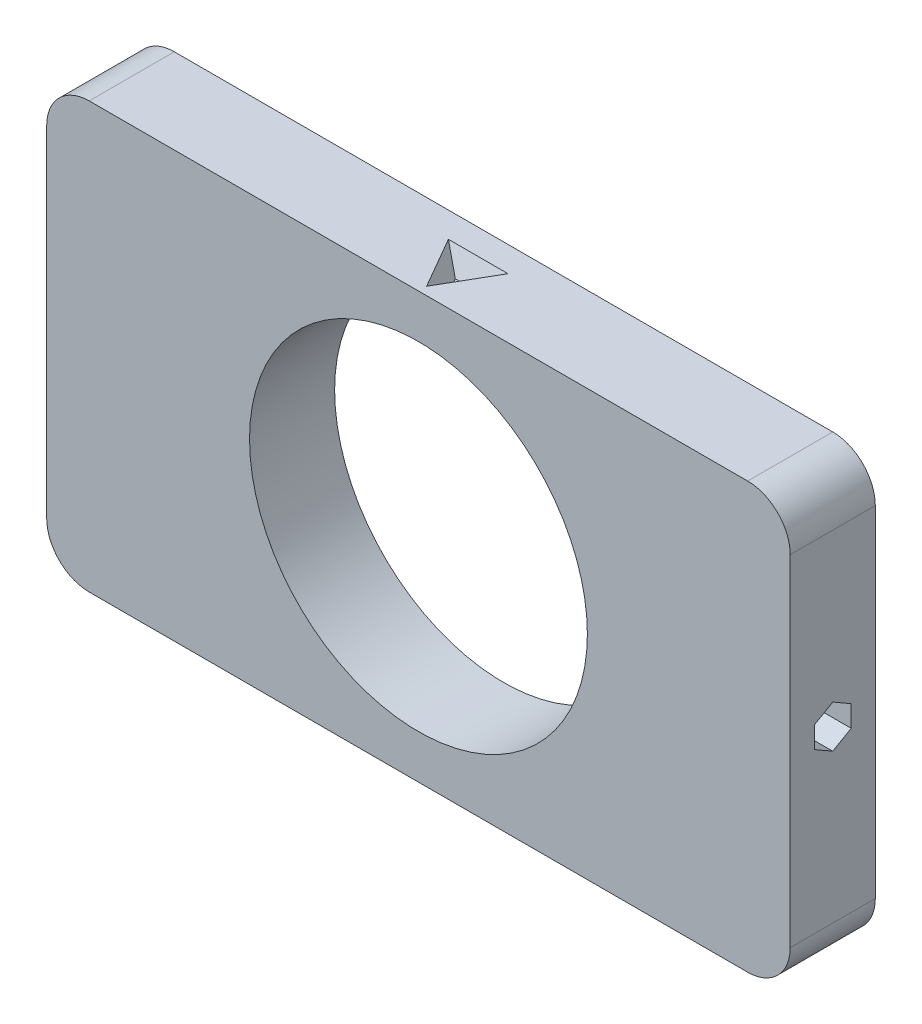
ISO-10303-21;
HEADER;
FILE_DESCRIPTION(('STEP AP214'),'2;1');
FILE_NAME('part.step','',(''),(''),'','','');
FILE_SCHEMA(('AUTOMOTIVE_DESIGN { 1 0 10303 214 1 1 1 1 }'));
ENDSEC;
DATA;
#1=APPLICATION_CONTEXT('core data for automotive mechanical design processes');
#2=APPLICATION_PROTOCOL_DEFINITION('international standard','automotive_design',2000,#1);
#3=PRODUCT_CONTEXT('',#1,'mechanical');
#4=PRODUCT('Part','Part','',(#3));
#5=PRODUCT_RELATED_PRODUCT_CATEGORY('part','',(#4));
#6=PRODUCT_DEFINITION_FORMATION('','',#4);
#7=PRODUCT_DEFINITION_CONTEXT('part definition',#1,'design');
#8=PRODUCT_DEFINITION('design','',#6,#7);
#9=PRODUCT_DEFINITION_SHAPE('','',#8);
#10=(LENGTH_UNIT() NAMED_UNIT(*) SI_UNIT(.MILLI.,.METRE.));
#11=(NAMED_UNIT(*) PLANE_ANGLE_UNIT() SI_UNIT($,.RADIAN.));
#12=(NAMED_UNIT(*) SI_UNIT($,.STERADIAN.) SOLID_ANGLE_UNIT());
#13=UNCERTAINTY_MEASURE_WITH_UNIT(LENGTH_MEASURE(1.E-05),#10,'distance_accuracy_value','');
#14=(GEOMETRIC_REPRESENTATION_CONTEXT(3) GLOBAL_UNCERTAINTY_ASSIGNED_CONTEXT((#13)) GLOBAL_UNIT_ASSIGNED_CONTEXT((#10,
#11,#12)) REPRESENTATION_CONTEXT('',''));
#15=CARTESIAN_POINT('',(0.,0.,0.));
#16=DIRECTION('',(0.,0.,1.));
#17=DIRECTION('',(1.,0.,0.));
#18=AXIS2_PLACEMENT_3D('',#15,#16,#17);
#19=CARTESIAN_POINT('',(-77.3807179941776,-39.9898991315528,20.));
#20=DIRECTION('',(0.,0.,-1.));
#21=DIRECTION('',(-1.,0.,0.));
#22=AXIS2_PLACEMENT_3D('',#19,#20,#21);
#23=PLANE('',#22);
#24=CARTESIAN_POINT('',(-77.3807179941776,-39.9898991315528,20.));
#25=DIRECTION('',(0.,0.,1.));
#26=DIRECTION('',(-1.,0.,0.));
#27=AXIS2_PLACEMENT_3D('',#24,#25,#26);
#28=CIRCLE('',#27,9.99999999999999);
#29=CARTESIAN_POINT('',(-87.3807179941776,-39.9898991315527,20.));
#30=VERTEX_POINT('',#29);
#31=CARTESIAN_POINT('',(-77.3807179941775,-49.9898991315528,20.));
#32=VERTEX_POINT('',#31);
#33=EDGE_CURVE('E222',#30,#32,#28,.T.);
#34=ORIENTED_EDGE('',*,*,#33,.T.);
#35=DIRECTION('',(1.,0.,0.));
#36=VECTOR('',#35,1.);
#37=CARTESIAN_POINT('',(77.3807179941775,-49.9898991315528,20.));
#38=LINE('',#37,#36);
#39=CARTESIAN_POINT('',(77.3807179941775,-49.9898991315528,20.));
#40=VERTEX_POINT('',#39);
#41=EDGE_CURVE('E225',#32,#40,#38,.T.);
#42=ORIENTED_EDGE('',*,*,#41,.T.);
#43=CARTESIAN_POINT('',(77.3807179941776,-39.9898991315528,20.));
#44=DIRECTION('',(0.,0.,1.));
#45=DIRECTION('',(1.,0.,0.));
#46=AXIS2_PLACEMENT_3D('',#43,#44,#45);
#47=CIRCLE('',#46,9.99999999999999);
#48=CARTESIAN_POINT('',(87.3807179941776,-39.9898991315528,20.));
#49=VERTEX_POINT('',#48);
#50=EDGE_CURVE('E228',#40,#49,#47,.T.);
#51=ORIENTED_EDGE('',*,*,#50,.T.);
#52=DIRECTION('',(0.,1.,0.));
#53=VECTOR('',#52,1.);
#54=CARTESIAN_POINT('',(87.3807179941776,-39.9898991315527,20.));
#55=LINE('',#54,#53);
#56=CARTESIAN_POINT('',(87.3807179941776,39.9898991315527,20.));
#57=VERTEX_POINT('',#56);
#58=EDGE_CURVE('E230',#49,#57,#55,.T.);
#59=ORIENTED_EDGE('',*,*,#58,.T.);
#60=CARTESIAN_POINT('',(77.3807179941776,39.9898991315528,20.));
#61=DIRECTION('',(0.,0.,1.));
#62=DIRECTION('',(1.,0.,0.));
#63=AXIS2_PLACEMENT_3D('',#60,#61,#62);
#64=CIRCLE('',#63,9.99999999999999);
#65=CARTESIAN_POINT('',(77.3807179941775,49.9898991315528,20.));
#66=VERTEX_POINT('',#65);
#67=EDGE_CURVE('E232',#57,#66,#64,.T.);
#68=ORIENTED_EDGE('',*,*,#67,.T.);
#69=DIRECTION('',(-1.,0.,0.));
#70=VECTOR('',#69,1.);
#71=CARTESIAN_POINT('',(77.3807179941775,49.9898991315528,20.));
#72=LINE('',#71,#70);
#73=CARTESIAN_POINT('',(-77.3807179941775,49.9898991315528,20.));
#74=VERTEX_POINT('',#73);
#75=EDGE_CURVE('E234',#66,#74,#72,.T.);
#76=ORIENTED_EDGE('',*,*,#75,.T.);
#77=CARTESIAN_POINT('',(-77.3807179941776,39.9898991315528,20.));
#78=DIRECTION('',(0.,0.,1.));
#79=DIRECTION('',(1.,0.,0.));
#80=AXIS2_PLACEMENT_3D('',#77,#78,#79);
#81=CIRCLE('',#80,9.99999999999999);
#82=CARTESIAN_POINT('',(-87.3807179941776,39.9898991315527,20.));
#83=VERTEX_POINT('',#82);
#84=EDGE_CURVE('E236',#74,#83,#81,.T.);
#85=ORIENTED_EDGE('',*,*,#84,.T.);
#86=DIRECTION('',(0.,-1.,0.));
#87=VECTOR('',#86,1.);
#88=CARTESIAN_POINT('',(-87.3807179941776,-39.9898991315527,20.));
#89=LINE('',#88,#87);
#90=EDGE_CURVE('E238',#83,#30,#89,.T.);
#91=ORIENTED_EDGE('',*,*,#90,.T.);
#92=EDGE_LOOP('',(#34,#42,#51,#59,#68,#76,#85,#91));
#93=FACE_BOUND('',#92,.T.);
#94=CARTESIAN_POINT('',(0.,0.,20.));
#95=DIRECTION('',(0.,0.,1.));
#96=DIRECTION('',(1.,0.,0.));
#97=AXIS2_PLACEMENT_3D('',#94,#95,#96);
#98=CIRCLE('',#97,39.70520295939);
#99=CARTESIAN_POINT('',(39.7052029593901,0.,20.));
#100=VERTEX_POINT('',#99);
#101=EDGE_CURVE('E216',#100,#100,#98,.T.);
#102=ORIENTED_EDGE('',*,*,#101,.F.);
#103=EDGE_LOOP('',(#102));
#104=FACE_BOUND('',#103,.T.);
#105=ADVANCED_FACE('F33',(#93,#104),#23,.F.);
#106=CARTESIAN_POINT('',(-77.3807179941776,-39.9898991315528,0.));
#107=DIRECTION('',(0.,0.,-1.));
#108=DIRECTION('',(-1.,0.,0.));
#109=AXIS2_PLACEMENT_3D('',#106,#107,#108);
#110=PLANE('',#109);
#111=CARTESIAN_POINT('',(-77.3807179941776,-39.9898991315528,0.));
#112=DIRECTION('',(0.,0.,1.));
#113=DIRECTION('',(-1.,0.,0.));
#114=AXIS2_PLACEMENT_3D('',#111,#112,#113);
#115=CIRCLE('',#114,9.99999999999999);
#116=CARTESIAN_POINT('',(-87.3807179941776,-39.9898991315527,0.));
#117=VERTEX_POINT('',#116);
#118=CARTESIAN_POINT('',(-77.3807179941775,-49.9898991315528,0.));
#119=VERTEX_POINT('',#118);
#120=EDGE_CURVE('E219',#117,#119,#115,.T.);
#121=ORIENTED_EDGE('',*,*,#120,.F.);
#122=DIRECTION('',(0.,-1.,0.));
#123=VECTOR('',#122,1.);
#124=CARTESIAN_POINT('',(-87.3807179941776,-39.9898991315527,0.));
#125=LINE('',#124,#123);
#126=CARTESIAN_POINT('',(-87.3807179941776,39.9898991315527,0.));
#127=VERTEX_POINT('',#126);
#128=EDGE_CURVE('E226',#127,#117,#125,.T.);
#129=ORIENTED_EDGE('',*,*,#128,.F.);
#130=CARTESIAN_POINT('',(-77.3807179941776,39.9898991315528,0.));
#131=DIRECTION('',(0.,0.,1.));
#132=DIRECTION('',(1.,0.,0.));
#133=AXIS2_PLACEMENT_3D('',#130,#131,#132);
#134=CIRCLE('',#133,9.99999999999999);
#135=CARTESIAN_POINT('',(-77.3807179941775,49.9898991315528,0.));
#136=VERTEX_POINT('',#135);
#137=EDGE_CURVE('E253',#136,#127,#134,.T.);
#138=ORIENTED_EDGE('',*,*,#137,.F.);
#139=DIRECTION('',(-1.,0.,0.));
#140=VECTOR('',#139,1.);
#141=CARTESIAN_POINT('',(77.3807179941775,49.9898991315528,0.));
#142=LINE('',#141,#140);
#143=CARTESIAN_POINT('',(77.3807179941775,49.9898991315528,0.));
#144=VERTEX_POINT('',#143);
#145=EDGE_CURVE('E251',#144,#136,#142,.T.);
#146=ORIENTED_EDGE('',*,*,#145,.F.);
#147=CARTESIAN_POINT('',(77.3807179941776,39.9898991315528,0.));
#148=DIRECTION('',(0.,0.,1.));
#149=DIRECTION('',(1.,0.,0.));
#150=AXIS2_PLACEMENT_3D('',#147,#148,#149);
#151=CIRCLE('',#150,9.99999999999999);
#152=CARTESIAN_POINT('',(87.3807179941776,39.9898991315527,0.));
#153=VERTEX_POINT('',#152);
#154=EDGE_CURVE('E249',#153,#144,#151,.T.);
#155=ORIENTED_EDGE('',*,*,#154,.F.);
#156=DIRECTION('',(0.,1.,0.));
#157=VECTOR('',#156,1.);
#158=CARTESIAN_POINT('',(87.3807179941776,-39.9898991315527,0.));
#159=LINE('',#158,#157);
#160=CARTESIAN_POINT('',(87.3807179941776,-39.9898991315528,0.));
#161=VERTEX_POINT('',#160);
#162=EDGE_CURVE('E247',#161,#153,#159,.T.);
#163=ORIENTED_EDGE('',*,*,#162,.F.);
#164=CARTESIAN_POINT('',(77.3807179941776,-39.9898991315528,0.));
#165=DIRECTION('',(0.,0.,1.));
#166=DIRECTION('',(1.,0.,0.));
#167=AXIS2_PLACEMENT_3D('',#164,#165,#166);
#168=CIRCLE('',#167,9.99999999999999);
#169=CARTESIAN_POINT('',(77.3807179941775,-49.9898991315528,0.));
#170=VERTEX_POINT('',#169);
#171=EDGE_CURVE('E245',#170,#161,#168,.T.);
#172=ORIENTED_EDGE('',*,*,#171,.F.);
#173=DIRECTION('',(1.,0.,0.));
#174=VECTOR('',#173,1.);
#175=CARTESIAN_POINT('',(77.3807179941775,-49.9898991315528,0.));
#176=LINE('',#175,#174);
#177=EDGE_CURVE('E243',#119,#170,#176,.T.);
#178=ORIENTED_EDGE('',*,*,#177,.F.);
#179=EDGE_LOOP('',(#121,#129,#138,#146,#155,#163,#172,#178));
#180=FACE_BOUND('',#179,.T.);
#181=CARTESIAN_POINT('',(0.,0.,0.));
#182=DIRECTION('',(0.,0.,1.));
#183=DIRECTION('',(1.,0.,0.));
#184=AXIS2_PLACEMENT_3D('',#181,#182,#183);
#185=CIRCLE('',#184,39.70520295939);
#186=CARTESIAN_POINT('',(39.7052029593901,0.,0.));
#187=VERTEX_POINT('',#186);
#188=EDGE_CURVE('E202',#187,#187,#185,.T.);
#189=ORIENTED_EDGE('',*,*,#188,.T.);
#190=EDGE_LOOP('',(#189));
#191=FACE_BOUND('',#190,.T.);
#192=ADVANCED_FACE('F283',(#180,#191),#110,.T.);
#193=CARTESIAN_POINT('',(-77.3807179941776,-39.9898991315528,20.));
#194=DIRECTION('',(0.,0.,-1.));
#195=DIRECTION('',(-1.,0.,0.));
#196=AXIS2_PLACEMENT_3D('',#193,#194,#195);
#197=CYLINDRICAL_SURFACE('',#196,9.99999999999999);
#198=ORIENTED_EDGE('',*,*,#120,.T.);
#199=DIRECTION('',(0.,0.,-1.));
#200=VECTOR('',#199,1.);
#201=CARTESIAN_POINT('',(-77.3807179941775,-49.9898991315528,20.));
#202=LINE('',#201,#200);
#203=EDGE_CURVE('E11',#32,#119,#202,.T.);
#204=ORIENTED_EDGE('',*,*,#203,.F.);
#205=ORIENTED_EDGE('',*,*,#33,.F.);
#206=DIRECTION('',(0.,0.,-1.));
#207=VECTOR('',#206,1.);
#208=CARTESIAN_POINT('',(-87.3807179941776,-39.9898991315527,20.));
#209=LINE('',#208,#207);
#210=EDGE_CURVE('E240',#30,#117,#209,.T.);
#211=ORIENTED_EDGE('',*,*,#210,.T.);
#212=EDGE_LOOP('',(#198,#204,#205,#211));
#213=FACE_BOUND('',#212,.T.);
#214=ADVANCED_FACE('F35',(#213),#197,.T.);
#215=CARTESIAN_POINT('',(77.3807179941775,-49.9898991315528,20.));
#216=DIRECTION('',(0.,1.,0.));
#217=DIRECTION('',(0.,0.,1.));
#218=AXIS2_PLACEMENT_3D('',#215,#216,#217);
#219=PLANE('',#218);
#220=ORIENTED_EDGE('',*,*,#177,.T.);
#221=DIRECTION('',(0.,0.,-1.));
#222=VECTOR('',#221,1.);
#223=CARTESIAN_POINT('',(77.3807179941775,-49.9898991315528,20.));
#224=LINE('',#223,#222);
#225=EDGE_CURVE('E41',#40,#170,#224,.T.);
#226=ORIENTED_EDGE('',*,*,#225,.F.);
#227=ORIENTED_EDGE('',*,*,#41,.F.);
#228=ORIENTED_EDGE('',*,*,#203,.T.);
#229=EDGE_LOOP('',(#220,#226,#227,#228));
#230=FACE_BOUND('',#229,.T.);
#231=ADVANCED_FACE('F301',(#230),#219,.F.);
#232=CARTESIAN_POINT('',(77.3807179941776,-39.9898991315528,20.));
#233=DIRECTION('',(0.,0.,-1.));
#234=DIRECTION('',(-1.,0.,0.));
#235=AXIS2_PLACEMENT_3D('',#232,#233,#234);
#236=CYLINDRICAL_SURFACE('',#235,9.99999999999999);
#237=ORIENTED_EDGE('',*,*,#171,.T.);
#238=DIRECTION('',(0.,0.,-1.));
#239=VECTOR('',#238,1.);
#240=CARTESIAN_POINT('',(87.3807179941776,-39.9898991315528,20.));
#241=LINE('',#240,#239);
#242=EDGE_CURVE('E270',#49,#161,#241,.T.);
#243=ORIENTED_EDGE('',*,*,#242,.F.);
#244=ORIENTED_EDGE('',*,*,#50,.F.);
#245=ORIENTED_EDGE('',*,*,#225,.T.);
#246=EDGE_LOOP('',(#237,#243,#244,#245));
#247=FACE_BOUND('',#246,.T.);
#248=ADVANCED_FACE('F277',(#247),#236,.T.);
#249=CARTESIAN_POINT('',(87.3807179941776,-39.9898991315527,20.));
#250=DIRECTION('',(-1.,0.,0.));
#251=DIRECTION('',(0.,0.,1.));
#252=AXIS2_PLACEMENT_3D('',#249,#250,#251);
#253=PLANE('',#252);
#254=DIRECTION('',(0.,-0.499999999999999,0.866025403784439));
#255=VECTOR('',#254,1.);
#256=CARTESIAN_POINT('',(87.3807179941776,5.,10.));
#257=LINE('',#256,#255);
#258=CARTESIAN_POINT('',(87.3807179941776,5.,10.));
#259=VERTEX_POINT('',#258);
#260=CARTESIAN_POINT('',(87.3807179941776,2.5,14.3301270189222));
#261=VERTEX_POINT('',#260);
#262=EDGE_CURVE('E48',#259,#261,#257,.T.);
#263=ORIENTED_EDGE('',*,*,#262,.F.);
#264=DIRECTION('',(0.,0.500000000000001,0.866025403784438));
#265=VECTOR('',#264,1.);
#266=CARTESIAN_POINT('',(87.3807179941776,2.5,5.66987298107781));
#267=LINE('',#266,#265);
#268=CARTESIAN_POINT('',(87.3807179941776,2.5,5.66987298107781));
#269=VERTEX_POINT('',#268);
#270=EDGE_CURVE('E175',#269,#259,#267,.T.);
#271=ORIENTED_EDGE('',*,*,#270,.F.);
#272=DIRECTION('',(0.,1.,0.));
#273=VECTOR('',#272,1.);
#274=CARTESIAN_POINT('',(87.3807179941776,-2.5,5.66987298107781));
#275=LINE('',#274,#273);
#276=CARTESIAN_POINT('',(87.3807179941776,-2.5,5.66987298107781));
#277=VERTEX_POINT('',#276);
#278=EDGE_CURVE('E193',#277,#269,#275,.T.);
#279=ORIENTED_EDGE('',*,*,#278,.F.);
#280=DIRECTION('',(0.,0.5,-0.866025403784439));
#281=VECTOR('',#280,1.);
#282=CARTESIAN_POINT('',(87.3807179941776,-5.,10.));
#283=LINE('',#282,#281);
#284=CARTESIAN_POINT('',(87.3807179941776,-5.,10.));
#285=VERTEX_POINT('',#284);
#286=EDGE_CURVE('E507',#285,#277,#283,.T.);
#287=ORIENTED_EDGE('',*,*,#286,.F.);
#288=DIRECTION('',(0.,-0.5,-0.866025403784439));
#289=VECTOR('',#288,1.);
#290=CARTESIAN_POINT('',(87.3807179941776,-2.5,14.3301270189222));
#291=LINE('',#290,#289);
#292=CARTESIAN_POINT('',(87.3807179941776,-2.5,14.3301270189222));
#293=VERTEX_POINT('',#292);
#294=EDGE_CURVE('E502',#293,#285,#291,.T.);
#295=ORIENTED_EDGE('',*,*,#294,.F.);
#296=DIRECTION('',(0.,-1.,0.));
#297=VECTOR('',#296,1.);
#298=CARTESIAN_POINT('',(87.3807179941776,2.5,14.3301270189222));
#299=LINE('',#298,#297);
#300=EDGE_CURVE('E501',#261,#293,#299,.T.);
#301=ORIENTED_EDGE('',*,*,#300,.F.);
#302=EDGE_LOOP('',(#263,#271,#279,#287,#295,#301));
#303=FACE_BOUND('',#302,.T.);
#304=ORIENTED_EDGE('',*,*,#162,.T.);
#305=DIRECTION('',(0.,0.,-1.));
#306=VECTOR('',#305,1.);
#307=CARTESIAN_POINT('',(87.3807179941776,39.9898991315527,20.));
#308=LINE('',#307,#306);
#309=EDGE_CURVE('E267',#57,#153,#308,.T.);
#310=ORIENTED_EDGE('',*,*,#309,.F.);
#311=ORIENTED_EDGE('',*,*,#58,.F.);
#312=ORIENTED_EDGE('',*,*,#242,.T.);
#313=EDGE_LOOP('',(#304,#310,#311,#312));
#314=FACE_BOUND('',#313,.T.);
#315=ADVANCED_FACE('F289',(#303,#314),#253,.F.);
#316=CARTESIAN_POINT('',(77.3807179941776,39.9898991315528,20.));
#317=DIRECTION('',(0.,0.,-1.));
#318=DIRECTION('',(-1.,0.,0.));
#319=AXIS2_PLACEMENT_3D('',#316,#317,#318);
#320=CYLINDRICAL_SURFACE('',#319,9.99999999999999);
#321=ORIENTED_EDGE('',*,*,#154,.T.);
#322=DIRECTION('',(0.,0.,-1.));
#323=VECTOR('',#322,1.);
#324=CARTESIAN_POINT('',(77.3807179941775,49.9898991315528,20.));
#325=LINE('',#324,#323);
#326=EDGE_CURVE('E264',#66,#144,#325,.T.);
#327=ORIENTED_EDGE('',*,*,#326,.F.);
#328=ORIENTED_EDGE('',*,*,#67,.F.);
#329=ORIENTED_EDGE('',*,*,#309,.T.);
#330=EDGE_LOOP('',(#321,#327,#328,#329));
#331=FACE_BOUND('',#330,.T.);
#332=ADVANCED_FACE('F293',(#331),#320,.T.);
#333=CARTESIAN_POINT('',(77.3807179941775,49.9898991315528,20.));
#334=DIRECTION('',(0.,-1.,0.));
#335=DIRECTION('',(0.,0.,-1.));
#336=AXIS2_PLACEMENT_3D('',#333,#334,#335);
#337=PLANE('',#336);
#338=DIRECTION('',(0.5,0.,-0.866025403784439));
#339=VECTOR('',#338,1.);
#340=CARTESIAN_POINT('',(0.,49.9898991315528,18.0829037686548));
#341=LINE('',#340,#339);
#342=CARTESIAN_POINT('',(0.,49.9898991315528,18.0829037686548));
#343=VERTEX_POINT('',#342);
#344=CARTESIAN_POINT('',(7.,49.9898991315528,5.95854811567262));
#345=VERTEX_POINT('',#344);
#346=EDGE_CURVE('E192',#343,#345,#341,.T.);
#347=ORIENTED_EDGE('',*,*,#346,.F.);
#348=DIRECTION('',(0.5,0.,0.866025403784439));
#349=VECTOR('',#348,1.);
#350=CARTESIAN_POINT('',(-7.,49.9898991315528,5.95854811567263));
#351=LINE('',#350,#349);
#352=CARTESIAN_POINT('',(-7.,49.9898991315528,5.95854811567263));
#353=VERTEX_POINT('',#352);
#354=EDGE_CURVE('E190',#353,#343,#351,.T.);
#355=ORIENTED_EDGE('',*,*,#354,.F.);
#356=DIRECTION('',(-1.,0.,0.));
#357=VECTOR('',#356,1.);
#358=CARTESIAN_POINT('',(7.,49.9898991315528,5.95854811567262));
#359=LINE('',#358,#357);
#360=EDGE_CURVE('E196',#345,#353,#359,.T.);
#361=ORIENTED_EDGE('',*,*,#360,.F.);
#362=EDGE_LOOP('',(#347,#355,#361));
#363=FACE_BOUND('',#362,.T.);
#364=ORIENTED_EDGE('',*,*,#145,.T.);
#365=DIRECTION('',(0.,0.,-1.));
#366=VECTOR('',#365,1.);
#367=CARTESIAN_POINT('',(-77.3807179941775,49.9898991315528,20.));
#368=LINE('',#367,#366);
#369=EDGE_CURVE('E261',#74,#136,#368,.T.);
#370=ORIENTED_EDGE('',*,*,#369,.F.);
#371=ORIENTED_EDGE('',*,*,#75,.F.);
#372=ORIENTED_EDGE('',*,*,#326,.T.);
#373=EDGE_LOOP('',(#364,#370,#371,#372));
#374=FACE_BOUND('',#373,.T.);
#375=ADVANCED_FACE('F314',(#363,#374),#337,.F.);
#376=CARTESIAN_POINT('',(-77.3807179941776,39.9898991315528,20.));
#377=DIRECTION('',(0.,0.,-1.));
#378=DIRECTION('',(-1.,0.,0.));
#379=AXIS2_PLACEMENT_3D('',#376,#377,#378);
#380=CYLINDRICAL_SURFACE('',#379,9.99999999999999);
#381=ORIENTED_EDGE('',*,*,#137,.T.);
#382=DIRECTION('',(0.,0.,-1.));
#383=VECTOR('',#382,1.);
#384=CARTESIAN_POINT('',(-87.3807179941776,39.9898991315527,20.));
#385=LINE('',#384,#383);
#386=EDGE_CURVE('E258',#83,#127,#385,.T.);
#387=ORIENTED_EDGE('',*,*,#386,.F.);
#388=ORIENTED_EDGE('',*,*,#84,.F.);
#389=ORIENTED_EDGE('',*,*,#369,.T.);
#390=EDGE_LOOP('',(#381,#387,#388,#389));
#391=FACE_BOUND('',#390,.T.);
#392=ADVANCED_FACE('F312',(#391),#380,.T.);
#393=CARTESIAN_POINT('',(-87.3807179941776,-39.9898991315527,20.));
#394=DIRECTION('',(1.,0.,0.));
#395=DIRECTION('',(0.,0.,-1.));
#396=AXIS2_PLACEMENT_3D('',#393,#394,#395);
#397=PLANE('',#396);
#398=ORIENTED_EDGE('',*,*,#128,.T.);
#399=ORIENTED_EDGE('',*,*,#210,.F.);
#400=ORIENTED_EDGE('',*,*,#90,.F.);
#401=ORIENTED_EDGE('',*,*,#386,.T.);
#402=EDGE_LOOP('',(#398,#399,#400,#401));
#403=FACE_BOUND('',#402,.T.);
#404=ADVANCED_FACE('F307',(#403),#397,.F.);
#405=CARTESIAN_POINT('',(0.,0.,20.));
#406=DIRECTION('',(0.,0.,-1.));
#407=DIRECTION('',(-1.,0.,0.));
#408=AXIS2_PLACEMENT_3D('',#405,#406,#407);
#409=CYLINDRICAL_SURFACE('',#408,39.70520295939);
#410=CARTESIAN_POINT('',(0.,0.,1.33974596215562));
#411=DIRECTION('',(0.,0.866025403784438,-0.500000000000001));
#412=DIRECTION('',(0.,-0.500000000000001,-0.866025403784438));
#413=AXIS2_PLACEMENT_3D('',#410,#411,#412);
#414=ELLIPSE('',#413,79.41040591878,39.70520295939);
#415=CARTESIAN_POINT('',(39.6264197480211,2.5,5.66987298107781));
#416=VERTEX_POINT('',#415);
#417=CARTESIAN_POINT('',(39.3891246671763,5.,10.));
#418=VERTEX_POINT('',#417);
#419=EDGE_CURVE('E169',#416,#418,#414,.F.);
#420=ORIENTED_EDGE('',*,*,#419,.T.);
#421=CARTESIAN_POINT('',(0.,0.,18.6602540378444));
#422=DIRECTION('',(0.,0.866025403784439,0.499999999999999));
#423=DIRECTION('',(0.,0.499999999999999,-0.866025403784439));
#424=AXIS2_PLACEMENT_3D('',#421,#422,#423);
#425=ELLIPSE('',#424,79.4104059187802,39.70520295939);
#426=CARTESIAN_POINT('',(39.6264197480211,2.5,14.3301270189222));
#427=VERTEX_POINT('',#426);
#428=EDGE_CURVE('E161',#418,#427,#425,.F.);
#429=ORIENTED_EDGE('',*,*,#428,.T.);
#430=CARTESIAN_POINT('',(0.,0.,14.3301270189222));
#431=DIRECTION('',(0.,0.,1.));
#432=DIRECTION('',(1.,0.,0.));
#433=AXIS2_PLACEMENT_3D('',#430,#431,#432);
#434=CIRCLE('',#433,39.70520295939);
#435=CARTESIAN_POINT('',(39.6264197480211,-2.5,14.3301270189222));
#436=VERTEX_POINT('',#435);
#437=EDGE_CURVE('E151',#427,#436,#434,.F.);
#438=ORIENTED_EDGE('',*,*,#437,.T.);
#439=CARTESIAN_POINT('',(0.,0.,18.6602540378444));
#440=DIRECTION('',(0.,-0.866025403784439,0.5));
#441=DIRECTION('',(0.,-0.5,-0.866025403784439));
#442=AXIS2_PLACEMENT_3D('',#439,#440,#441);
#443=ELLIPSE('',#442,79.4104059187801,39.70520295939);
#444=CARTESIAN_POINT('',(39.3891246671763,-5.,10.));
#445=VERTEX_POINT('',#444);
#446=EDGE_CURVE('E182',#436,#445,#443,.F.);
#447=ORIENTED_EDGE('',*,*,#446,.T.);
#448=CARTESIAN_POINT('',(0.,0.,1.33974596215563));
#449=DIRECTION('',(0.,-0.866025403784439,-0.5));
#450=DIRECTION('',(0.,0.5,-0.866025403784439));
#451=AXIS2_PLACEMENT_3D('',#448,#449,#450);
#452=ELLIPSE('',#451,79.4104059187801,39.70520295939);
#453=CARTESIAN_POINT('',(39.6264197480211,-2.5,5.66987298107781));
#454=VERTEX_POINT('',#453);
#455=EDGE_CURVE('E179',#445,#454,#452,.F.);
#456=ORIENTED_EDGE('',*,*,#455,.T.);
#457=CARTESIAN_POINT('',(0.,0.,5.66987298107781));
#458=DIRECTION('',(0.,0.,-1.));
#459=DIRECTION('',(0.,1.,0.));
#460=AXIS2_PLACEMENT_3D('',#457,#458,#459);
#461=CIRCLE('',#460,39.70520295939);
#462=EDGE_CURVE('E163',#454,#416,#461,.F.);
#463=ORIENTED_EDGE('',*,*,#462,.T.);
#464=EDGE_LOOP('',(#420,#429,#438,#447,#456,#463));
#465=FACE_BOUND('',#464,.T.);
#466=ORIENTED_EDGE('',*,*,#101,.T.);
#467=EDGE_LOOP('',(#466));
#468=FACE_BOUND('',#467,.T.);
#469=ORIENTED_EDGE('',*,*,#188,.F.);
#470=EDGE_LOOP('',(#469));
#471=FACE_BOUND('',#470,.T.);
#472=ADVANCED_FACE('F166',(#465,#468,#471),#409,.F.);
#473=CARTESIAN_POINT('',(-7.,49.9898991315528,5.95854811567263));
#474=DIRECTION('',(-0.791153573830373,-0.406736643075801,0.4567727288213));
#475=DIRECTION('',(0.5,0.,0.866025403784439));
#476=AXIS2_PLACEMENT_3D('',#473,#474,#475);
#477=PLANE('',#476);
#478=ORIENTED_EDGE('',*,*,#354,.T.);
#479=DIRECTION('',(0.,0.746827378946148,0.665017944161229));
#480=VECTOR('',#479,1.);
#481=CARTESIAN_POINT('',(0.,43.9682941495193,12.7209212294586));
#482=LINE('',#481,#480);
#483=CARTESIAN_POINT('',(0.,44.9898991315528,13.6306169155694));
#484=VERTEX_POINT('',#483);
#485=EDGE_CURVE('E204',#484,#343,#482,.T.);
#486=ORIENTED_EDGE('',*,*,#485,.F.);
#487=DIRECTION('',(0.5,0.,0.866025403784439));
#488=VECTOR('',#487,1.);
#489=CARTESIAN_POINT('',(-5.90223025906849,44.9898991315528,3.40765422889235));
#490=LINE('',#489,#488);
#491=CARTESIAN_POINT('',(-3.14420648029259,44.9898991315528,8.18469154221531));
#492=VERTEX_POINT('',#491);
#493=EDGE_CURVE('E199',#492,#484,#490,.T.);
#494=ORIENTED_EDGE('',*,*,#493,.F.);
#495=DIRECTION('',(-0.575922433616125,0.746827378946148,-0.332508972080614));
#496=VECTOR('',#495,1.);
#497=CARTESIAN_POINT('',(-2.35638690640752,43.9682941495193,8.63953938527071));
#498=LINE('',#497,#496);
#499=EDGE_CURVE('E200',#492,#353,#498,.T.);
#500=ORIENTED_EDGE('',*,*,#499,.T.);
#501=EDGE_LOOP('',(#478,#486,#494,#500));
#502=FACE_BOUND('',#501,.T.);
#503=ADVANCED_FACE('F338',(#502),#477,.F.);
#504=CARTESIAN_POINT('',(7.,49.9898991315528,5.95854811567262));
#505=DIRECTION('',(0.,-0.406736643075801,-0.9135454576426));
#506=DIRECTION('',(0.,0.913545457642601,-0.406736643075801));
#507=AXIS2_PLACEMENT_3D('',#504,#505,#506);
#508=PLANE('',#507);
#509=ORIENTED_EDGE('',*,*,#360,.T.);
#510=ORIENTED_EDGE('',*,*,#499,.F.);
#511=DIRECTION('',(-1.,0.,0.));
#512=VECTOR('',#511,1.);
#513=CARTESIAN_POINT('',(0.,44.9898991315528,8.18469154221531));
#514=LINE('',#513,#512);
#515=CARTESIAN_POINT('',(3.14420648029259,44.9898991315528,8.18469154221531));
#516=VERTEX_POINT('',#515);
#517=EDGE_CURVE('E207',#516,#492,#514,.T.);
#518=ORIENTED_EDGE('',*,*,#517,.F.);
#519=DIRECTION('',(0.575922433616125,0.746827378946148,-0.332508972080614));
#520=VECTOR('',#519,1.);
#521=CARTESIAN_POINT('',(2.35638690640752,43.9682941495193,8.63953938527071));
#522=LINE('',#521,#520);
#523=EDGE_CURVE('E203',#516,#345,#522,.T.);
#524=ORIENTED_EDGE('',*,*,#523,.T.);
#525=EDGE_LOOP('',(#509,#510,#518,#524));
#526=FACE_BOUND('',#525,.T.);
#527=ADVANCED_FACE('F342',(#526),#508,.F.);
#528=CARTESIAN_POINT('',(0.,49.9898991315528,18.0829037686548));
#529=DIRECTION('',(0.791153573830373,-0.406736643075801,0.4567727288213));
#530=DIRECTION('',(0.5,0.,-0.866025403784439));
#531=AXIS2_PLACEMENT_3D('',#528,#529,#530);
#532=PLANE('',#531);
#533=ORIENTED_EDGE('',*,*,#346,.T.);
#534=ORIENTED_EDGE('',*,*,#523,.F.);
#535=DIRECTION('',(0.5,0.,-0.866025403784439));
#536=VECTOR('',#535,1.);
#537=CARTESIAN_POINT('',(5.90223025906849,44.9898991315528,3.40765422889235));
#538=LINE('',#537,#536);
#539=EDGE_CURVE('E211',#484,#516,#538,.T.);
#540=ORIENTED_EDGE('',*,*,#539,.F.);
#541=ORIENTED_EDGE('',*,*,#485,.T.);
#542=EDGE_LOOP('',(#533,#534,#540,#541));
#543=FACE_BOUND('',#542,.T.);
#544=ADVANCED_FACE('F348',(#543),#532,.F.);
#545=CARTESIAN_POINT('',(0.,44.9898991315528,0.));
#546=DIRECTION('',(0.,1.,0.));
#547=DIRECTION('',(0.,0.,1.));
#548=AXIS2_PLACEMENT_3D('',#545,#546,#547);
#549=PLANE('',#548);
#550=ORIENTED_EDGE('',*,*,#493,.T.);
#551=ORIENTED_EDGE('',*,*,#539,.T.);
#552=ORIENTED_EDGE('',*,*,#517,.T.);
#553=EDGE_LOOP('',(#550,#551,#552));
#554=FACE_BOUND('',#553,.T.);
#555=ADVANCED_FACE('F352',(#554),#549,.T.);
#556=CARTESIAN_POINT('',(-87.3817179941776,2.5,5.66987298107781));
#557=DIRECTION('',(0.,0.866025403784438,-0.500000000000001));
#558=DIRECTION('',(0.,0.500000000000001,0.866025403784438));
#559=AXIS2_PLACEMENT_3D('',#556,#557,#558);
#560=PLANE('',#559);
#561=DIRECTION('',(1.,0.,0.));
#562=VECTOR('',#561,1.);
#563=CARTESIAN_POINT('',(-87.3817179941776,2.5,5.66987298107781));
#564=LINE('',#563,#562);
#565=EDGE_CURVE('E177',#416,#269,#564,.T.);
#566=ORIENTED_EDGE('',*,*,#565,.T.);
#567=ORIENTED_EDGE('',*,*,#270,.T.);
#568=DIRECTION('',(1.,0.,0.));
#569=VECTOR('',#568,1.);
#570=CARTESIAN_POINT('',(-87.3817179941776,5.,10.));
#571=LINE('',#570,#569);
#572=EDGE_CURVE('E170',#418,#259,#571,.T.);
#573=ORIENTED_EDGE('',*,*,#572,.F.);
#574=ORIENTED_EDGE('',*,*,#419,.F.);
#575=EDGE_LOOP('',(#566,#567,#573,#574));
#576=FACE_BOUND('',#575,.T.);
#577=ADVANCED_FACE('F359',(#576),#560,.F.);
#578=CARTESIAN_POINT('',(-87.3817179941776,5.,10.));
#579=DIRECTION('',(0.,0.866025403784439,0.499999999999999));
#580=DIRECTION('',(0.,-0.499999999999999,0.866025403784439));
#581=AXIS2_PLACEMENT_3D('',#578,#579,#580);
#582=PLANE('',#581);
#583=ORIENTED_EDGE('',*,*,#572,.T.);
#584=ORIENTED_EDGE('',*,*,#262,.T.);
#585=DIRECTION('',(1.,0.,0.));
#586=VECTOR('',#585,1.);
#587=CARTESIAN_POINT('',(-87.3817179941776,2.5,14.3301270189222));
#588=LINE('',#587,#586);
#589=EDGE_CURVE('E153',#427,#261,#588,.T.);
#590=ORIENTED_EDGE('',*,*,#589,.F.);
#591=ORIENTED_EDGE('',*,*,#428,.F.);
#592=EDGE_LOOP('',(#583,#584,#590,#591));
#593=FACE_BOUND('',#592,.T.);
#594=ADVANCED_FACE('F160',(#593),#582,.F.);
#595=CARTESIAN_POINT('',(-87.3817179941776,-2.5,5.66987298107781));
#596=DIRECTION('',(0.,0.,-1.));
#597=DIRECTION('',(0.,1.,0.));
#598=AXIS2_PLACEMENT_3D('',#595,#596,#597);
#599=PLANE('',#598);
#600=DIRECTION('',(1.,0.,0.));
#601=VECTOR('',#600,1.);
#602=CARTESIAN_POINT('',(-87.3817179941776,-2.5,5.66987298107781));
#603=LINE('',#602,#601);
#604=EDGE_CURVE('E180',#454,#277,#603,.T.);
#605=ORIENTED_EDGE('',*,*,#604,.T.);
#606=ORIENTED_EDGE('',*,*,#278,.T.);
#607=ORIENTED_EDGE('',*,*,#565,.F.);
#608=ORIENTED_EDGE('',*,*,#462,.F.);
#609=EDGE_LOOP('',(#605,#606,#607,#608));
#610=FACE_BOUND('',#609,.T.);
#611=ADVANCED_FACE('F373',(#610),#599,.F.);
#612=CARTESIAN_POINT('',(-87.3817179941776,-5.,10.));
#613=DIRECTION('',(0.,-0.866025403784439,-0.5));
#614=DIRECTION('',(0.,0.5,-0.866025403784439));
#615=AXIS2_PLACEMENT_3D('',#612,#613,#614);
#616=PLANE('',#615);
#617=DIRECTION('',(1.,0.,0.));
#618=VECTOR('',#617,1.);
#619=CARTESIAN_POINT('',(-87.3817179941776,-5.,10.));
#620=LINE('',#619,#618);
#621=EDGE_CURVE('E158',#445,#285,#620,.T.);
#622=ORIENTED_EDGE('',*,*,#621,.T.);
#623=ORIENTED_EDGE('',*,*,#286,.T.);
#624=ORIENTED_EDGE('',*,*,#604,.F.);
#625=ORIENTED_EDGE('',*,*,#455,.F.);
#626=EDGE_LOOP('',(#622,#623,#624,#625));
#627=FACE_BOUND('',#626,.T.);
#628=ADVANCED_FACE('F378',(#627),#616,.F.);
#629=CARTESIAN_POINT('',(-87.3817179941776,-2.5,14.3301270189222));
#630=DIRECTION('',(0.,-0.866025403784439,0.5));
#631=DIRECTION('',(0.,-0.5,-0.866025403784439));
#632=AXIS2_PLACEMENT_3D('',#629,#630,#631);
#633=PLANE('',#632);
#634=DIRECTION('',(1.,0.,0.));
#635=VECTOR('',#634,1.);
#636=CARTESIAN_POINT('',(-87.3817179941776,-2.5,14.3301270189222));
#637=LINE('',#636,#635);
#638=EDGE_CURVE('E56',#436,#293,#637,.T.);
#639=ORIENTED_EDGE('',*,*,#638,.T.);
#640=ORIENTED_EDGE('',*,*,#294,.T.);
#641=ORIENTED_EDGE('',*,*,#621,.F.);
#642=ORIENTED_EDGE('',*,*,#446,.F.);
#643=EDGE_LOOP('',(#639,#640,#641,#642));
#644=FACE_BOUND('',#643,.T.);
#645=ADVANCED_FACE('F382',(#644),#633,.F.);
#646=CARTESIAN_POINT('',(-87.3817179941776,2.5,14.3301270189222));
#647=DIRECTION('',(0.,0.,1.));
#648=DIRECTION('',(1.,0.,0.));
#649=AXIS2_PLACEMENT_3D('',#646,#647,#648);
#650=PLANE('',#649);
#651=ORIENTED_EDGE('',*,*,#589,.T.);
#652=ORIENTED_EDGE('',*,*,#300,.T.);
#653=ORIENTED_EDGE('',*,*,#638,.F.);
#654=ORIENTED_EDGE('',*,*,#437,.F.);
#655=EDGE_LOOP('',(#651,#652,#653,#654));
#656=FACE_BOUND('',#655,.T.);
#657=ADVANCED_FACE('F152',(#656),#650,.F.);
#658=CLOSED_SHELL('',(#105,#192,#214,#231,#248,#315,#332,#375,#392,#404,#472,#503,#527,#544,
#555,#577,#594,#611,#628,#645,#657));
#659=MANIFOLD_SOLID_BREP('B2',#658);
#660=ADVANCED_BREP_SHAPE_REPRESENTATION('',(#18,#659),#14);
#661=SHAPE_DEFINITION_REPRESENTATION(#9,#660);
ENDSEC;
END-ISO-10303-21;
